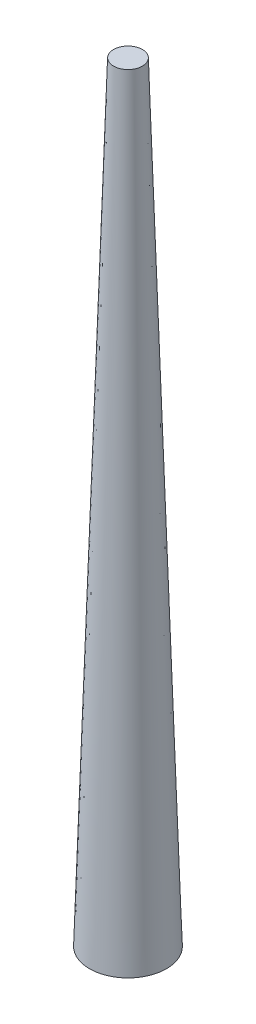
ISO-10303-21;
HEADER;
FILE_DESCRIPTION(('STEP AP214'),'2;1');
FILE_NAME('part.step','',(''),(''),'','','');
FILE_SCHEMA(('AUTOMOTIVE_DESIGN { 1 0 10303 214 1 1 1 1 }'));
ENDSEC;
DATA;
#1=APPLICATION_CONTEXT('core data for automotive mechanical design processes');
#2=APPLICATION_PROTOCOL_DEFINITION('international standard','automotive_design',2000,#1);
#3=PRODUCT_CONTEXT('',#1,'mechanical');
#4=PRODUCT('Part','Part','',(#3));
#5=PRODUCT_RELATED_PRODUCT_CATEGORY('part','',(#4));
#6=PRODUCT_DEFINITION_FORMATION('','',#4);
#7=PRODUCT_DEFINITION_CONTEXT('part definition',#1,'design');
#8=PRODUCT_DEFINITION('design','',#6,#7);
#9=PRODUCT_DEFINITION_SHAPE('','',#8);
#10=(LENGTH_UNIT() NAMED_UNIT(*) SI_UNIT(.MILLI.,.METRE.));
#11=(NAMED_UNIT(*) PLANE_ANGLE_UNIT() SI_UNIT($,.RADIAN.));
#12=(NAMED_UNIT(*) SI_UNIT($,.STERADIAN.) SOLID_ANGLE_UNIT());
#13=UNCERTAINTY_MEASURE_WITH_UNIT(LENGTH_MEASURE(1.E-05),#10,'distance_accuracy_value','');
#14=(GEOMETRIC_REPRESENTATION_CONTEXT(3) GLOBAL_UNCERTAINTY_ASSIGNED_CONTEXT((#13)) GLOBAL_UNIT_ASSIGNED_CONTEXT((#10,
#11,#12)) REPRESENTATION_CONTEXT('',''));
#15=CARTESIAN_POINT('',(0.,0.,0.));
#16=DIRECTION('',(0.,0.,1.));
#17=DIRECTION('',(1.,0.,0.));
#18=AXIS2_PLACEMENT_3D('',#15,#16,#17);
#19=CARTESIAN_POINT('',(0.,0.,0.));
#20=DIRECTION('',(0.,-1.,0.));
#21=DIRECTION('',(1.,0.,0.));
#22=AXIS2_PLACEMENT_3D('',#19,#20,#21);
#23=PLANE('',#22);
#24=CARTESIAN_POINT('',(0.,0.,0.));
#25=DIRECTION('',(0.,1.,0.));
#26=DIRECTION('',(-1.,0.,0.));
#27=AXIS2_PLACEMENT_3D('',#24,#25,#26);
#28=CIRCLE('',#27,50.8);
#29=CARTESIAN_POINT('',(-50.8,0.,0.));
#30=VERTEX_POINT('',#29);
#31=EDGE_CURVE('E10',#30,#30,#28,.T.);
#32=ORIENTED_EDGE('',*,*,#31,.F.);
#33=EDGE_LOOP('',(#32));
#34=FACE_BOUND('',#33,.T.);
#35=ADVANCED_FACE('F34',(#34),#23,.T.);
#36=CARTESIAN_POINT('',(0.,1016.,0.));
#37=DIRECTION('',(0.,-1.,0.));
#38=DIRECTION('',(1.,0.,0.));
#39=AXIS2_PLACEMENT_3D('',#36,#37,#38);
#40=CONICAL_SURFACE('',#39,19.05,0.0312398334302683);
#41=ORIENTED_EDGE('',*,*,#31,.T.);
#42=EDGE_LOOP('',(#41));
#43=FACE_BOUND('',#42,.T.);
#44=CARTESIAN_POINT('',(0.,1016.,0.));
#45=DIRECTION('',(0.,1.,0.));
#46=DIRECTION('',(-1.,0.,0.));
#47=AXIS2_PLACEMENT_3D('',#44,#45,#46);
#48=CIRCLE('',#47,19.05);
#49=CARTESIAN_POINT('',(-19.05,1016.,0.));
#50=VERTEX_POINT('',#49);
#51=EDGE_CURVE('E40',#50,#50,#48,.T.);
#52=ORIENTED_EDGE('',*,*,#51,.F.);
#53=EDGE_LOOP('',(#52));
#54=FACE_BOUND('',#53,.T.);
#55=ADVANCED_FACE('F48',(#43,#54),#40,.T.);
#56=CARTESIAN_POINT('',(-19.05,1016.,0.));
#57=DIRECTION('',(0.,1.,0.));
#58=DIRECTION('',(-1.,0.,0.));
#59=AXIS2_PLACEMENT_3D('',#56,#57,#58);
#60=PLANE('',#59);
#61=ORIENTED_EDGE('',*,*,#51,.T.);
#62=EDGE_LOOP('',(#61));
#63=FACE_BOUND('',#62,.T.);
#64=ADVANCED_FACE('F46',(#63),#60,.T.);
#65=CLOSED_SHELL('',(#35,#55,#64));
#66=MANIFOLD_SOLID_BREP('B2',#65);
#67=ADVANCED_BREP_SHAPE_REPRESENTATION('',(#18,#66),#14);
#68=SHAPE_DEFINITION_REPRESENTATION(#9,#67);
ENDSEC;
END-ISO-10303-21;
